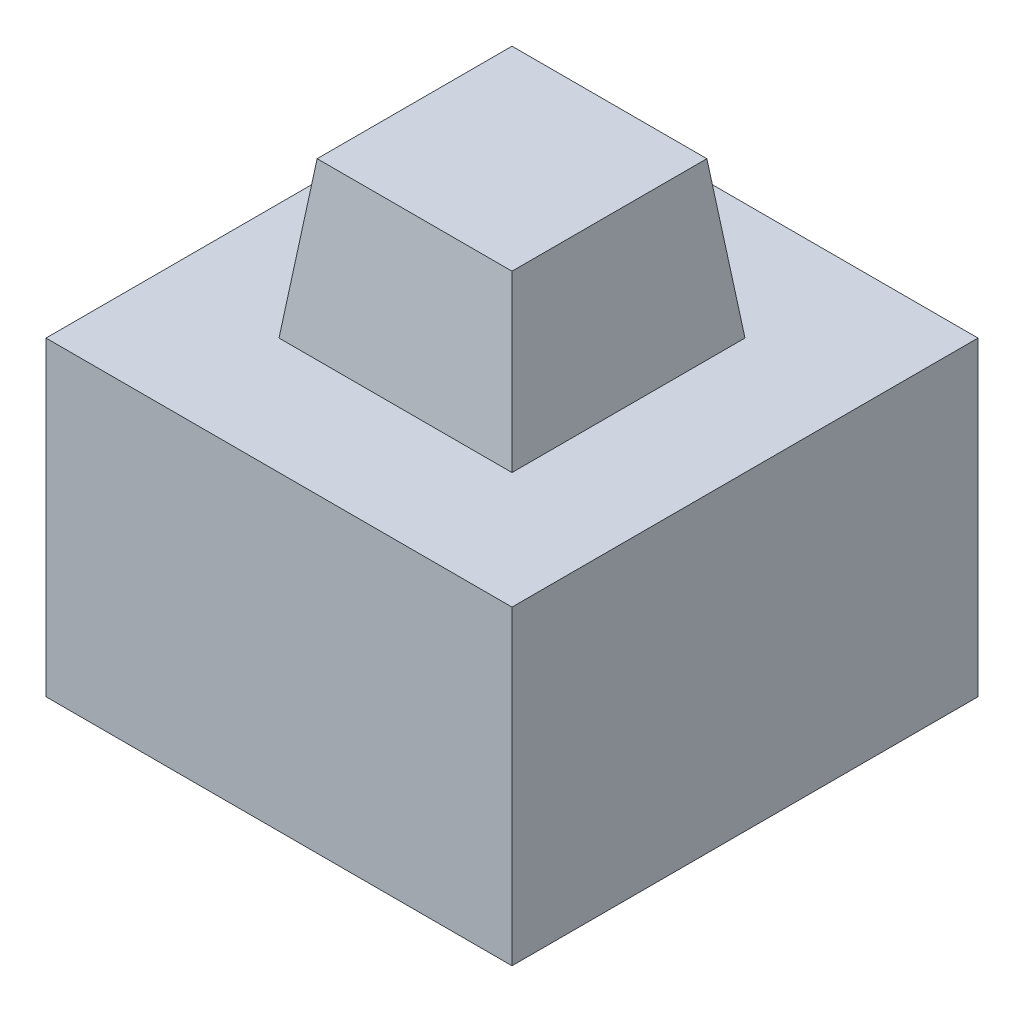
ISO-10303-21;
HEADER;
FILE_DESCRIPTION(('STEP AP214'),'2;1');
FILE_NAME('part.step','',(''),(''),'','','');
FILE_SCHEMA(('AUTOMOTIVE_DESIGN { 1 0 10303 214 1 1 1 1 }'));
ENDSEC;
DATA;
#1=APPLICATION_CONTEXT('core data for automotive mechanical design processes');
#2=APPLICATION_PROTOCOL_DEFINITION('international standard','automotive_design',2000,#1);
#3=PRODUCT_CONTEXT('',#1,'mechanical');
#4=PRODUCT('Part','Part','',(#3));
#5=PRODUCT_RELATED_PRODUCT_CATEGORY('part','',(#4));
#6=PRODUCT_DEFINITION_FORMATION('','',#4);
#7=PRODUCT_DEFINITION_CONTEXT('part definition',#1,'design');
#8=PRODUCT_DEFINITION('design','',#6,#7);
#9=PRODUCT_DEFINITION_SHAPE('','',#8);
#10=(LENGTH_UNIT() NAMED_UNIT(*) SI_UNIT(.MILLI.,.METRE.));
#11=(NAMED_UNIT(*) PLANE_ANGLE_UNIT() SI_UNIT($,.RADIAN.));
#12=(NAMED_UNIT(*) SI_UNIT($,.STERADIAN.) SOLID_ANGLE_UNIT());
#13=UNCERTAINTY_MEASURE_WITH_UNIT(LENGTH_MEASURE(1.E-05),#10,'distance_accuracy_value','');
#14=(GEOMETRIC_REPRESENTATION_CONTEXT(3) GLOBAL_UNCERTAINTY_ASSIGNED_CONTEXT((#13)) GLOBAL_UNIT_ASSIGNED_CONTEXT((#10,
#11,#12)) REPRESENTATION_CONTEXT('',''));
#15=CARTESIAN_POINT('',(0.,0.,0.));
#16=DIRECTION('',(0.,0.,1.));
#17=DIRECTION('',(1.,0.,0.));
#18=AXIS2_PLACEMENT_3D('',#15,#16,#17);
#19=CARTESIAN_POINT('',(30.,40.,-30.));
#20=DIRECTION('',(-1.,0.,0.));
#21=DIRECTION('',(0.,0.,1.));
#22=AXIS2_PLACEMENT_3D('',#19,#20,#21);
#23=PLANE('',#22);
#24=DIRECTION('',(0.,0.,-1.));
#25=VECTOR('',#24,1.);
#26=CARTESIAN_POINT('',(30.,0.,-30.));
#27=LINE('',#26,#25);
#28=CARTESIAN_POINT('',(30.,0.,30.));
#29=VERTEX_POINT('',#28);
#30=CARTESIAN_POINT('',(30.,0.,-30.));
#31=VERTEX_POINT('',#30);
#32=EDGE_CURVE('E119',#29,#31,#27,.T.);
#33=ORIENTED_EDGE('',*,*,#32,.T.);
#34=DIRECTION('',(0.,-1.,0.));
#35=VECTOR('',#34,1.);
#36=CARTESIAN_POINT('',(30.,40.,-30.));
#37=LINE('',#36,#35);
#38=CARTESIAN_POINT('',(30.,40.,-30.));
#39=VERTEX_POINT('',#38);
#40=EDGE_CURVE('E11',#39,#31,#37,.T.);
#41=ORIENTED_EDGE('',*,*,#40,.F.);
#42=DIRECTION('',(0.,0.,-1.));
#43=VECTOR('',#42,1.);
#44=CARTESIAN_POINT('',(30.,40.,-30.));
#45=LINE('',#44,#43);
#46=CARTESIAN_POINT('',(30.,40.,30.));
#47=VERTEX_POINT('',#46);
#48=EDGE_CURVE('E135',#47,#39,#45,.T.);
#49=ORIENTED_EDGE('',*,*,#48,.F.);
#50=DIRECTION('',(0.,-1.,0.));
#51=VECTOR('',#50,1.);
#52=CARTESIAN_POINT('',(30.,40.,30.));
#53=LINE('',#52,#51);
#54=EDGE_CURVE('E149',#47,#29,#53,.T.);
#55=ORIENTED_EDGE('',*,*,#54,.T.);
#56=EDGE_LOOP('',(#33,#41,#49,#55));
#57=FACE_BOUND('',#56,.T.);
#58=ADVANCED_FACE('F39',(#57),#23,.F.);
#59=CARTESIAN_POINT('',(-30.,40.,-30.));
#60=DIRECTION('',(0.,0.,1.));
#61=DIRECTION('',(1.,0.,0.));
#62=AXIS2_PLACEMENT_3D('',#59,#60,#61);
#63=PLANE('',#62);
#64=DIRECTION('',(-1.,0.,0.));
#65=VECTOR('',#64,1.);
#66=CARTESIAN_POINT('',(-30.,0.,-30.));
#67=LINE('',#66,#65);
#68=CARTESIAN_POINT('',(-30.,0.,-30.));
#69=VERTEX_POINT('',#68);
#70=EDGE_CURVE('E153',#31,#69,#67,.T.);
#71=ORIENTED_EDGE('',*,*,#70,.T.);
#72=DIRECTION('',(0.,-1.,0.));
#73=VECTOR('',#72,1.);
#74=CARTESIAN_POINT('',(-30.,40.,-30.));
#75=LINE('',#74,#73);
#76=CARTESIAN_POINT('',(-30.,40.,-30.));
#77=VERTEX_POINT('',#76);
#78=EDGE_CURVE('E50',#77,#69,#75,.T.);
#79=ORIENTED_EDGE('',*,*,#78,.F.);
#80=DIRECTION('',(-1.,0.,0.));
#81=VECTOR('',#80,1.);
#82=CARTESIAN_POINT('',(-30.,40.,-30.));
#83=LINE('',#82,#81);
#84=EDGE_CURVE('E139',#39,#77,#83,.T.);
#85=ORIENTED_EDGE('',*,*,#84,.F.);
#86=ORIENTED_EDGE('',*,*,#40,.T.);
#87=EDGE_LOOP('',(#71,#79,#85,#86));
#88=FACE_BOUND('',#87,.T.);
#89=ADVANCED_FACE('F202',(#88),#63,.F.);
#90=CARTESIAN_POINT('',(-30.,40.,-30.));
#91=DIRECTION('',(1.,0.,0.));
#92=DIRECTION('',(0.,0.,-1.));
#93=AXIS2_PLACEMENT_3D('',#90,#91,#92);
#94=PLANE('',#93);
#95=DIRECTION('',(0.,0.,1.));
#96=VECTOR('',#95,1.);
#97=CARTESIAN_POINT('',(-30.,0.,-30.));
#98=LINE('',#97,#96);
#99=CARTESIAN_POINT('',(-30.,0.,30.));
#100=VERTEX_POINT('',#99);
#101=EDGE_CURVE('E156',#69,#100,#98,.T.);
#102=ORIENTED_EDGE('',*,*,#101,.T.);
#103=DIRECTION('',(0.,-1.,0.));
#104=VECTOR('',#103,1.);
#105=CARTESIAN_POINT('',(-30.,40.,30.));
#106=LINE('',#105,#104);
#107=CARTESIAN_POINT('',(-30.,40.,30.));
#108=VERTEX_POINT('',#107);
#109=EDGE_CURVE('E164',#108,#100,#106,.T.);
#110=ORIENTED_EDGE('',*,*,#109,.F.);
#111=DIRECTION('',(0.,0.,1.));
#112=VECTOR('',#111,1.);
#113=CARTESIAN_POINT('',(-30.,40.,-30.));
#114=LINE('',#113,#112);
#115=EDGE_CURVE('E143',#77,#108,#114,.T.);
#116=ORIENTED_EDGE('',*,*,#115,.F.);
#117=ORIENTED_EDGE('',*,*,#78,.T.);
#118=EDGE_LOOP('',(#102,#110,#116,#117));
#119=FACE_BOUND('',#118,.T.);
#120=ADVANCED_FACE('F208',(#119),#94,.F.);
#121=CARTESIAN_POINT('',(-30.,40.,30.));
#122=DIRECTION('',(0.,0.,-1.));
#123=DIRECTION('',(-1.,0.,0.));
#124=AXIS2_PLACEMENT_3D('',#121,#122,#123);
#125=PLANE('',#124);
#126=DIRECTION('',(1.,0.,0.));
#127=VECTOR('',#126,1.);
#128=CARTESIAN_POINT('',(-30.,0.,30.));
#129=LINE('',#128,#127);
#130=EDGE_CURVE('E140',#100,#29,#129,.T.);
#131=ORIENTED_EDGE('',*,*,#130,.T.);
#132=ORIENTED_EDGE('',*,*,#54,.F.);
#133=DIRECTION('',(1.,0.,0.));
#134=VECTOR('',#133,1.);
#135=CARTESIAN_POINT('',(-30.,40.,30.));
#136=LINE('',#135,#134);
#137=EDGE_CURVE('E146',#108,#47,#136,.T.);
#138=ORIENTED_EDGE('',*,*,#137,.F.);
#139=ORIENTED_EDGE('',*,*,#109,.T.);
#140=EDGE_LOOP('',(#131,#132,#138,#139));
#141=FACE_BOUND('',#140,.T.);
#142=ADVANCED_FACE('F224',(#141),#125,.F.);
#143=CARTESIAN_POINT('',(0.,40.,0.));
#144=DIRECTION('',(0.,1.,0.));
#145=DIRECTION('',(0.,0.,1.));
#146=AXIS2_PLACEMENT_3D('',#143,#144,#145);
#147=PLANE('',#146);
#148=DIRECTION('',(0.,0.,-1.));
#149=VECTOR('',#148,1.);
#150=CARTESIAN_POINT('',(15.,40.,-15.));
#151=LINE('',#150,#149);
#152=CARTESIAN_POINT('',(15.,40.,15.));
#153=VERTEX_POINT('',#152);
#154=CARTESIAN_POINT('',(15.,40.,-15.));
#155=VERTEX_POINT('',#154);
#156=EDGE_CURVE('E59',#153,#155,#151,.T.);
#157=ORIENTED_EDGE('',*,*,#156,.F.);
#158=DIRECTION('',(1.,0.,0.));
#159=VECTOR('',#158,1.);
#160=CARTESIAN_POINT('',(-15.,40.,15.));
#161=LINE('',#160,#159);
#162=CARTESIAN_POINT('',(-15.,40.,15.));
#163=VERTEX_POINT('',#162);
#164=EDGE_CURVE('E131',#163,#153,#161,.T.);
#165=ORIENTED_EDGE('',*,*,#164,.F.);
#166=DIRECTION('',(0.,0.,1.));
#167=VECTOR('',#166,1.);
#168=CARTESIAN_POINT('',(-15.,40.,-15.));
#169=LINE('',#168,#167);
#170=CARTESIAN_POINT('',(-15.,40.,-15.));
#171=VERTEX_POINT('',#170);
#172=EDGE_CURVE('E82',#171,#163,#169,.T.);
#173=ORIENTED_EDGE('',*,*,#172,.F.);
#174=DIRECTION('',(-1.,0.,0.));
#175=VECTOR('',#174,1.);
#176=CARTESIAN_POINT('',(-15.,40.,-15.));
#177=LINE('',#176,#175);
#178=EDGE_CURVE('E107',#155,#171,#177,.T.);
#179=ORIENTED_EDGE('',*,*,#178,.F.);
#180=EDGE_LOOP('',(#157,#165,#173,#179));
#181=FACE_BOUND('',#180,.T.);
#182=ORIENTED_EDGE('',*,*,#48,.T.);
#183=ORIENTED_EDGE('',*,*,#84,.T.);
#184=ORIENTED_EDGE('',*,*,#115,.T.);
#185=ORIENTED_EDGE('',*,*,#137,.T.);
#186=EDGE_LOOP('',(#182,#183,#184,#185));
#187=FACE_BOUND('',#186,.T.);
#188=ADVANCED_FACE('F108',(#181,#187),#147,.T.);
#189=CARTESIAN_POINT('',(0.,0.,0.));
#190=DIRECTION('',(0.,1.,0.));
#191=DIRECTION('',(0.,0.,1.));
#192=AXIS2_PLACEMENT_3D('',#189,#190,#191);
#193=PLANE('',#192);
#194=ORIENTED_EDGE('',*,*,#32,.F.);
#195=ORIENTED_EDGE('',*,*,#130,.F.);
#196=ORIENTED_EDGE('',*,*,#101,.F.);
#197=ORIENTED_EDGE('',*,*,#70,.F.);
#198=EDGE_LOOP('',(#194,#195,#196,#197));
#199=FACE_BOUND('',#198,.T.);
#200=ADVANCED_FACE('F215',(#199),#193,.F.);
#201=CARTESIAN_POINT('',(15.,40.,-15.));
#202=DIRECTION('',(0.992546151641322,0.121869343405148,0.));
#203=DIRECTION('',(-0.121869343405148,0.992546151641322,0.));
#204=AXIS2_PLACEMENT_3D('',#201,#202,#203);
#205=PLANE('',#204);
#206=ORIENTED_EDGE('',*,*,#156,.T.);
#207=DIRECTION('',(0.120974291151355,-0.985256536015293,-0.120974291151355));
#208=VECTOR('',#207,1.);
#209=CARTESIAN_POINT('',(14.5609566264128,43.5757213314007,-14.5609566264128));
#210=LINE('',#209,#208);
#211=CARTESIAN_POINT('',(12.5443087819419,60.,-12.5443087819419));
#212=VERTEX_POINT('',#211);
#213=EDGE_CURVE('E114',#212,#155,#210,.T.);
#214=ORIENTED_EDGE('',*,*,#213,.F.);
#215=DIRECTION('',(0.,0.,1.));
#216=VECTOR('',#215,1.);
#217=CARTESIAN_POINT('',(12.5443087819419,60.,-15.));
#218=LINE('',#217,#216);
#219=CARTESIAN_POINT('',(12.5443087819419,60.,12.5443087819419));
#220=VERTEX_POINT('',#219);
#221=EDGE_CURVE('E134',#220,#212,#218,.F.);
#222=ORIENTED_EDGE('',*,*,#221,.F.);
#223=DIRECTION('',(0.120974291151355,-0.985256536015293,0.120974291151355));
#224=VECTOR('',#223,1.);
#225=CARTESIAN_POINT('',(14.5609566264128,43.5757213314007,14.5609566264128));
#226=LINE('',#225,#224);
#227=EDGE_CURVE('E125',#220,#153,#226,.T.);
#228=ORIENTED_EDGE('',*,*,#227,.T.);
#229=EDGE_LOOP('',(#206,#214,#222,#228));
#230=FACE_BOUND('',#229,.T.);
#231=ADVANCED_FACE('F123',(#230),#205,.T.);
#232=CARTESIAN_POINT('',(-15.,40.,-15.));
#233=DIRECTION('',(0.,0.121869343405148,-0.992546151641322));
#234=DIRECTION('',(0.,0.992546151641322,0.121869343405148));
#235=AXIS2_PLACEMENT_3D('',#232,#233,#234);
#236=PLANE('',#235);
#237=ORIENTED_EDGE('',*,*,#178,.T.);
#238=DIRECTION('',(-0.120974291151355,-0.985256536015293,-0.120974291151355));
#239=VECTOR('',#238,1.);
#240=CARTESIAN_POINT('',(-15.,40.,-15.));
#241=LINE('',#240,#239);
#242=CARTESIAN_POINT('',(-12.5443087819419,60.,-12.5443087819419));
#243=VERTEX_POINT('',#242);
#244=EDGE_CURVE('E120',#243,#171,#241,.T.);
#245=ORIENTED_EDGE('',*,*,#244,.F.);
#246=DIRECTION('',(1.,0.,0.));
#247=VECTOR('',#246,1.);
#248=CARTESIAN_POINT('',(-15.,60.,-12.5443087819419));
#249=LINE('',#248,#247);
#250=EDGE_CURVE('E43',#212,#243,#249,.F.);
#251=ORIENTED_EDGE('',*,*,#250,.F.);
#252=ORIENTED_EDGE('',*,*,#213,.T.);
#253=EDGE_LOOP('',(#237,#245,#251,#252));
#254=FACE_BOUND('',#253,.T.);
#255=ADVANCED_FACE('F115',(#254),#236,.T.);
#256=CARTESIAN_POINT('',(-15.,40.,-15.));
#257=DIRECTION('',(-0.992546151641322,0.121869343405148,0.));
#258=DIRECTION('',(-0.121869343405148,-0.992546151641322,0.));
#259=AXIS2_PLACEMENT_3D('',#256,#257,#258);
#260=PLANE('',#259);
#261=ORIENTED_EDGE('',*,*,#172,.T.);
#262=DIRECTION('',(-0.120974291151355,-0.985256536015293,0.120974291151355));
#263=VECTOR('',#262,1.);
#264=CARTESIAN_POINT('',(-15.,40.,15.));
#265=LINE('',#264,#263);
#266=CARTESIAN_POINT('',(-12.5443087819419,60.,12.5443087819419));
#267=VERTEX_POINT('',#266);
#268=EDGE_CURVE('E171',#267,#163,#265,.T.);
#269=ORIENTED_EDGE('',*,*,#268,.F.);
#270=DIRECTION('',(0.,0.,-1.));
#271=VECTOR('',#270,1.);
#272=CARTESIAN_POINT('',(-12.5443087819419,60.,-15.));
#273=LINE('',#272,#271);
#274=EDGE_CURVE('E180',#243,#267,#273,.F.);
#275=ORIENTED_EDGE('',*,*,#274,.F.);
#276=ORIENTED_EDGE('',*,*,#244,.T.);
#277=EDGE_LOOP('',(#261,#269,#275,#276));
#278=FACE_BOUND('',#277,.T.);
#279=ADVANCED_FACE('F191',(#278),#260,.T.);
#280=CARTESIAN_POINT('',(-15.,40.,15.));
#281=DIRECTION('',(0.,0.121869343405148,0.992546151641322));
#282=DIRECTION('',(0.,-0.992546151641322,0.121869343405148));
#283=AXIS2_PLACEMENT_3D('',#280,#281,#282);
#284=PLANE('',#283);
#285=ORIENTED_EDGE('',*,*,#164,.T.);
#286=ORIENTED_EDGE('',*,*,#227,.F.);
#287=DIRECTION('',(-1.,0.,0.));
#288=VECTOR('',#287,1.);
#289=CARTESIAN_POINT('',(-15.,60.,12.5443087819419));
#290=LINE('',#289,#288);
#291=EDGE_CURVE('E179',#267,#220,#290,.F.);
#292=ORIENTED_EDGE('',*,*,#291,.F.);
#293=ORIENTED_EDGE('',*,*,#268,.T.);
#294=EDGE_LOOP('',(#285,#286,#292,#293));
#295=FACE_BOUND('',#294,.T.);
#296=ADVANCED_FACE('F41',(#295),#284,.T.);
#297=CARTESIAN_POINT('',(0.,60.,0.));
#298=DIRECTION('',(0.,1.,0.));
#299=DIRECTION('',(0.,0.,1.));
#300=AXIS2_PLACEMENT_3D('',#297,#298,#299);
#301=PLANE('',#300);
#302=ORIENTED_EDGE('',*,*,#221,.T.);
#303=ORIENTED_EDGE('',*,*,#250,.T.);
#304=ORIENTED_EDGE('',*,*,#274,.T.);
#305=ORIENTED_EDGE('',*,*,#291,.T.);
#306=EDGE_LOOP('',(#302,#303,#304,#305));
#307=FACE_BOUND('',#306,.T.);
#308=ADVANCED_FACE('F187',(#307),#301,.T.);
#309=CLOSED_SHELL('',(#58,#89,#120,#142,#188,#200,#231,#255,#279,#296,#308));
#310=MANIFOLD_SOLID_BREP('B2',#309);
#311=ADVANCED_BREP_SHAPE_REPRESENTATION('',(#18,#310),#14);
#312=SHAPE_DEFINITION_REPRESENTATION(#9,#311);
ENDSEC;
END-ISO-10303-21;
